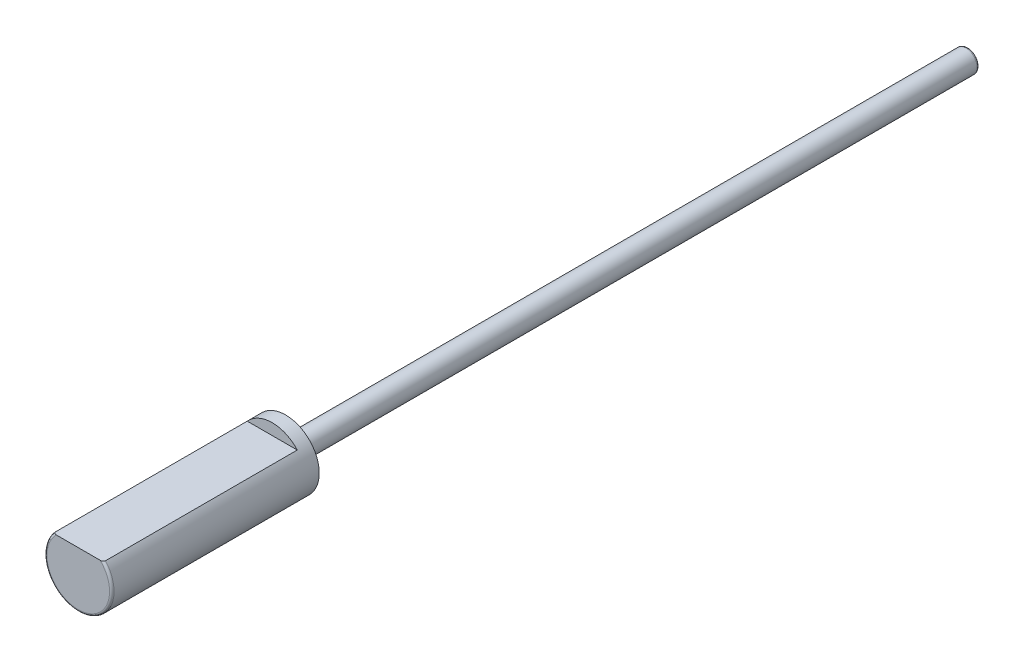
ISO-10303-21;
HEADER;
FILE_DESCRIPTION(('STEP AP214'),'2;1');
FILE_NAME('part.step','',(''),(''),'','','');
FILE_SCHEMA(('AUTOMOTIVE_DESIGN { 1 0 10303 214 1 1 1 1 }'));
ENDSEC;
DATA;
#1=APPLICATION_CONTEXT('core data for automotive mechanical design processes');
#2=APPLICATION_PROTOCOL_DEFINITION('international standard','automotive_design',2000,#1);
#3=PRODUCT_CONTEXT('',#1,'mechanical');
#4=PRODUCT('Part','Part','',(#3));
#5=PRODUCT_RELATED_PRODUCT_CATEGORY('part','',(#4));
#6=PRODUCT_DEFINITION_FORMATION('','',#4);
#7=PRODUCT_DEFINITION_CONTEXT('part definition',#1,'design');
#8=PRODUCT_DEFINITION('design','',#6,#7);
#9=PRODUCT_DEFINITION_SHAPE('','',#8);
#10=(LENGTH_UNIT() NAMED_UNIT(*) SI_UNIT(.MILLI.,.METRE.));
#11=(NAMED_UNIT(*) PLANE_ANGLE_UNIT() SI_UNIT($,.RADIAN.));
#12=(NAMED_UNIT(*) SI_UNIT($,.STERADIAN.) SOLID_ANGLE_UNIT());
#13=UNCERTAINTY_MEASURE_WITH_UNIT(LENGTH_MEASURE(1.E-05),#10,'distance_accuracy_value','');
#14=(GEOMETRIC_REPRESENTATION_CONTEXT(3) GLOBAL_UNCERTAINTY_ASSIGNED_CONTEXT((#13)) GLOBAL_UNIT_ASSIGNED_CONTEXT((#10,
#11,#12)) REPRESENTATION_CONTEXT('',''));
#15=CARTESIAN_POINT('',(0.,0.,0.));
#16=DIRECTION('',(0.,0.,1.));
#17=DIRECTION('',(1.,0.,0.));
#18=AXIS2_PLACEMENT_3D('',#15,#16,#17);
#19=CARTESIAN_POINT('',(0.,0.,-9.27));
#20=DIRECTION('',(0.,0.,1.));
#21=DIRECTION('',(1.,0.,0.));
#22=AXIS2_PLACEMENT_3D('',#19,#20,#21);
#23=PLANE('',#22);
#24=CARTESIAN_POINT('',(0.,0.,-9.27));
#25=DIRECTION('',(0.,0.,1.));
#26=DIRECTION('',(1.,0.,0.));
#27=AXIS2_PLACEMENT_3D('',#24,#25,#26);
#28=CIRCLE('',#27,1.5);
#29=CARTESIAN_POINT('',(1.5,0.,-9.27));
#30=VERTEX_POINT('',#29);
#31=EDGE_CURVE('E80',#30,#30,#28,.T.);
#32=ORIENTED_EDGE('',*,*,#31,.F.);
#33=EDGE_LOOP('',(#32));
#34=FACE_BOUND('',#33,.T.);
#35=CARTESIAN_POINT('',(0.,0.,-9.27));
#36=DIRECTION('',(0.,0.,1.));
#37=DIRECTION('',(1.,0.,0.));
#38=AXIS2_PLACEMENT_3D('',#35,#36,#37);
#39=CIRCLE('',#38,0.5);
#40=CARTESIAN_POINT('',(0.5,0.,-9.27));
#41=VERTEX_POINT('',#40);
#42=EDGE_CURVE('E86',#41,#41,#39,.F.);
#43=ORIENTED_EDGE('',*,*,#42,.F.);
#44=EDGE_LOOP('',(#43));
#45=FACE_BOUND('',#44,.T.);
#46=ADVANCED_FACE('F32',(#34,#45),#23,.F.);
#47=CARTESIAN_POINT('',(0.,0.,-9.27));
#48=DIRECTION('',(0.,0.,1.));
#49=DIRECTION('',(1.,0.,0.));
#50=AXIS2_PLACEMENT_3D('',#47,#48,#49);
#51=CYLINDRICAL_SURFACE('',#50,1.5);
#52=DIRECTION('',(0.,0.,1.));
#53=VECTOR('',#52,1.);
#54=CARTESIAN_POINT('',(1.11803398874989,1.,-8.67));
#55=LINE('',#54,#53);
#56=CARTESIAN_POINT('',(1.11803398874989,1.,-8.67));
#57=VERTEX_POINT('',#56);
#58=CARTESIAN_POINT('',(1.11803398874989,1.,-0.0999999999999994));
#59=VERTEX_POINT('',#58);
#60=EDGE_CURVE('E75',#57,#59,#55,.T.);
#61=ORIENTED_EDGE('',*,*,#60,.T.);
#62=CARTESIAN_POINT('',(0.,0.,-0.0999999999999994));
#63=DIRECTION('',(0.,0.,1.));
#64=DIRECTION('',(1.,0.,0.));
#65=AXIS2_PLACEMENT_3D('',#62,#63,#64);
#66=CIRCLE('',#65,1.5);
#67=CARTESIAN_POINT('',(-1.11803398874989,1.,-0.0999999999999994));
#68=VERTEX_POINT('',#67);
#69=EDGE_CURVE('E11',#59,#68,#66,.F.);
#70=ORIENTED_EDGE('',*,*,#69,.T.);
#71=DIRECTION('',(0.,0.,1.));
#72=VECTOR('',#71,1.);
#73=CARTESIAN_POINT('',(-1.11803398874989,1.,-8.67));
#74=LINE('',#73,#72);
#75=CARTESIAN_POINT('',(-1.11803398874989,1.,-8.67));
#76=VERTEX_POINT('',#75);
#77=EDGE_CURVE('E73',#76,#68,#74,.T.);
#78=ORIENTED_EDGE('',*,*,#77,.F.);
#79=CARTESIAN_POINT('',(0.,0.,-8.67));
#80=DIRECTION('',(0.,0.,1.));
#81=DIRECTION('',(1.,0.,0.));
#82=AXIS2_PLACEMENT_3D('',#79,#80,#81);
#83=CIRCLE('',#82,1.5);
#84=EDGE_CURVE('E66',#57,#76,#83,.T.);
#85=ORIENTED_EDGE('',*,*,#84,.F.);
#86=EDGE_LOOP('',(#61,#70,#78,#85));
#87=FACE_BOUND('',#86,.T.);
#88=ORIENTED_EDGE('',*,*,#31,.T.);
#89=EDGE_LOOP('',(#88));
#90=FACE_BOUND('',#89,.T.);
#91=ADVANCED_FACE('F77',(#87,#90),#51,.T.);
#92=CARTESIAN_POINT('',(0.,0.,0.));
#93=DIRECTION('',(0.,0.,1.));
#94=DIRECTION('',(1.,0.,0.));
#95=AXIS2_PLACEMENT_3D('',#92,#93,#94);
#96=PLANE('',#95);
#97=DIRECTION('',(1.,0.,0.));
#98=VECTOR('',#97,1.);
#99=CARTESIAN_POINT('',(-1.11803398874989,1.,0.));
#100=LINE('',#99,#98);
#101=CARTESIAN_POINT('',(-0.979795897113271,1.,0.));
#102=VERTEX_POINT('',#101);
#103=CARTESIAN_POINT('',(0.979795897113271,1.,0.));
#104=VERTEX_POINT('',#103);
#105=EDGE_CURVE('E70',#102,#104,#100,.T.);
#106=ORIENTED_EDGE('',*,*,#105,.F.);
#107=CARTESIAN_POINT('',(0.,0.,0.));
#108=DIRECTION('',(0.,0.,1.));
#109=DIRECTION('',(1.,0.,0.));
#110=AXIS2_PLACEMENT_3D('',#107,#108,#109);
#111=CIRCLE('',#110,1.4);
#112=EDGE_CURVE('E95',#102,#104,#111,.T.);
#113=ORIENTED_EDGE('',*,*,#112,.T.);
#114=EDGE_LOOP('',(#106,#113));
#115=FACE_BOUND('',#114,.T.);
#116=ADVANCED_FACE('F110',(#115),#96,.T.);
#117=CARTESIAN_POINT('',(-1.11803398874989,1.,-8.67));
#118=DIRECTION('',(0.,-1.,0.));
#119=DIRECTION('',(0.,0.,-1.));
#120=AXIS2_PLACEMENT_3D('',#117,#118,#119);
#121=PLANE('',#120);
#122=ORIENTED_EDGE('',*,*,#105,.T.);
#123=CARTESIAN_POINT('',(0.979795897113271,1.,0.));
#124=CARTESIAN_POINT('',(0.990423010555319,1.,-1.03855861505107E-05));
#125=CARTESIAN_POINT('',(1.00110275061369,1.,-0.000833049056409117));
#126=CARTESIAN_POINT('',(1.02227176438242,1.,-0.0042959301923684));
#127=CARTESIAN_POINT('',(1.03275786657518,1.,-0.00695511620443514));
#128=CARTESIAN_POINT('',(1.0497101668996,1.,-0.0130979345120357));
#129=CARTESIAN_POINT('',(1.05637422178191,1.,-0.0160318171149528));
#130=CARTESIAN_POINT('',(1.06915806055887,1.,-0.0228850002330611));
#131=CARTESIAN_POINT('',(1.07527973170944,1.,-0.0268006863132385));
#132=CARTESIAN_POINT('',(1.08545710181324,1.,-0.0346886934187335));
#133=CARTESIAN_POINT('',(1.08967032194297,1.,-0.0384570563161133));
#134=CARTESIAN_POINT('',(1.09743993481315,1.,-0.0466256760007156));
#135=CARTESIAN_POINT('',(1.10099680338497,1.,-0.0510254708758903));
#136=CARTESIAN_POINT('',(1.10668854421872,1.,-0.059565933134492));
#137=CARTESIAN_POINT('',(1.10896390497243,1.,-0.0636127363771502));
#138=CARTESIAN_POINT('',(1.1128098959919,1.,-0.0720255110213822));
#139=CARTESIAN_POINT('',(1.11438186093413,1.,-0.0763908595187036));
#140=CARTESIAN_POINT('',(1.11636876981202,1.,-0.0839772157908912));
#141=CARTESIAN_POINT('',(1.1169898255533,1.,-0.0871452376113928));
#142=CARTESIAN_POINT('',(1.11782393669661,1.,-0.0935411698182698));
#143=CARTESIAN_POINT('',(1.11803611977568,1.,-0.0967691934467747));
#144=CARTESIAN_POINT('',(1.1180339887584,1.,-0.0999999999977711));
#145=B_SPLINE_CURVE_WITH_KNOTS('',3,(#123,#124,#125,#126,#127,#128,#129,#130,#131,#132,#133,
#134,#135,#136,#137,#138,#139,#140,#141,#142,#143,#144),.UNSPECIFIED.,.F.,.F.,(4,2,2,2,2,2,2,2,
2,2,4),(0.,0.0319385529641672,0.0642120123531967,0.0859848686758867,0.107678717461913,
0.124575849978059,0.141460684135519,0.155332463387052,0.169177808484579,0.178837784330725,
0.188518346854204),.UNSPECIFIED.);
#146=EDGE_CURVE('E41',#104,#59,#145,.T.);
#147=ORIENTED_EDGE('',*,*,#146,.T.);
#148=ORIENTED_EDGE('',*,*,#60,.F.);
#149=DIRECTION('',(1.,0.,0.));
#150=VECTOR('',#149,1.);
#151=CARTESIAN_POINT('',(-1.11803398874989,1.,-8.67));
#152=LINE('',#151,#150);
#153=EDGE_CURVE('E69',#76,#57,#152,.T.);
#154=ORIENTED_EDGE('',*,*,#153,.F.);
#155=ORIENTED_EDGE('',*,*,#77,.T.);
#156=CARTESIAN_POINT('',(-1.11803398874989,1.,-0.0999999999999994));
#157=CARTESIAN_POINT('',(-1.11804355506767,1.,-0.0953936566735407));
#158=CARTESIAN_POINT('',(-1.11760767495534,1.,-0.0907965481149597));
#159=CARTESIAN_POINT('',(-1.11592640755541,1.,-0.081786066391901));
#160=CARTESIAN_POINT('',(-1.11468694782349,1.,-0.0773715976645056));
#161=CARTESIAN_POINT('',(-1.11148112452686,1.,-0.0688294406720696));
#162=CARTESIAN_POINT('',(-1.10951626319663,1.,-0.0647011805365982));
#163=CARTESIAN_POINT('',(-1.10496989240239,1.,-0.0567944752876496));
#164=CARTESIAN_POINT('',(-1.1023872371825,1.,-0.0530166984615249));
#165=CARTESIAN_POINT('',(-1.09574105356226,1.,-0.0446268725765702));
#166=CARTESIAN_POINT('',(-1.09147393420041,1.,-0.0401761172993146));
#167=CARTESIAN_POINT('',(-1.08227689951012,1.,-0.0320267312284288));
#168=CARTESIAN_POINT('',(-1.0773460197302,1.,-0.0283292149248945));
#169=CARTESIAN_POINT('',(-1.06523258514584,1.,-0.0205173867655279));
#170=CARTESIAN_POINT('',(-1.05785982705629,1.,-0.0166988699011358));
#171=CARTESIAN_POINT('',(-1.04259227403405,1.,-0.0102854853180762));
#172=CARTESIAN_POINT('',(-1.03469614491658,1.,-0.00769389368522714));
#173=CARTESIAN_POINT('',(-1.01898120481267,1.,-0.00373257687759999));
#174=CARTESIAN_POINT('',(-1.01117441814706,1.,-0.00231388331917927));
#175=CARTESIAN_POINT('',(-0.995506567378695,1.,-0.000453420722760612));
#176=CARTESIAN_POINT('',(-0.987646425384097,1.,-3.9898205160243E-06));
#177=CARTESIAN_POINT('',(-0.979795897114114,1.,3.34790897037023E-12));
#178=B_SPLINE_CURVE_WITH_KNOTS('',3,(#156,#157,#158,#159,#160,#161,#162,#163,#164,#165,#166,
#167,#168,#169,#170,#171,#172,#173,#174,#175,#176,#177),.UNSPECIFIED.,.F.,.F.,(4,2,2,2,2,2,2,2,
2,2,4),(0.,0.0137838169773244,0.0274670978266051,0.0411221994763035,0.054802824843836,
0.073199155540583,0.091622510799885,0.116397542132985,0.141238358752926,0.164980587613975,
0.188534439423893),.UNSPECIFIED.);
#179=EDGE_CURVE('E98',#68,#102,#178,.T.);
#180=ORIENTED_EDGE('',*,*,#179,.T.);
#181=EDGE_LOOP('',(#122,#147,#148,#154,#155,#180));
#182=FACE_BOUND('',#181,.T.);
#183=ADVANCED_FACE('F72',(#182),#121,.F.);
#184=CARTESIAN_POINT('',(0.,0.,-8.67));
#185=DIRECTION('',(0.,0.,1.));
#186=DIRECTION('',(1.,0.,0.));
#187=AXIS2_PLACEMENT_3D('',#184,#185,#186);
#188=PLANE('',#187);
#189=ORIENTED_EDGE('',*,*,#84,.T.);
#190=ORIENTED_EDGE('',*,*,#153,.T.);
#191=EDGE_LOOP('',(#189,#190));
#192=FACE_BOUND('',#191,.T.);
#193=ADVANCED_FACE('F68',(#192),#188,.T.);
#194=CARTESIAN_POINT('',(0.,0.,-39.77));
#195=DIRECTION('',(0.,0.,1.));
#196=DIRECTION('',(1.,0.,0.));
#197=AXIS2_PLACEMENT_3D('',#194,#195,#196);
#198=CYLINDRICAL_SURFACE('',#197,0.5);
#199=CARTESIAN_POINT('',(0.,0.,-39.67));
#200=DIRECTION('',(0.,0.,-1.));
#201=DIRECTION('',(-1.,0.,0.));
#202=AXIS2_PLACEMENT_3D('',#199,#200,#201);
#203=CIRCLE('',#202,0.5);
#204=CARTESIAN_POINT('',(-0.5,0.,-39.67));
#205=VERTEX_POINT('',#204);
#206=EDGE_CURVE('E92',#205,#205,#203,.F.);
#207=ORIENTED_EDGE('',*,*,#206,.T.);
#208=EDGE_LOOP('',(#207));
#209=FACE_BOUND('',#208,.T.);
#210=ORIENTED_EDGE('',*,*,#42,.T.);
#211=EDGE_LOOP('',(#210));
#212=FACE_BOUND('',#211,.T.);
#213=ADVANCED_FACE('F129',(#209,#212),#198,.T.);
#214=CARTESIAN_POINT('',(0.,0.,-39.77));
#215=DIRECTION('',(0.,0.,-1.));
#216=DIRECTION('',(-1.,0.,0.));
#217=AXIS2_PLACEMENT_3D('',#214,#215,#216);
#218=PLANE('',#217);
#219=CARTESIAN_POINT('',(0.,0.,-39.77));
#220=DIRECTION('',(0.,0.,-1.));
#221=DIRECTION('',(-1.,0.,0.));
#222=AXIS2_PLACEMENT_3D('',#219,#220,#221);
#223=CIRCLE('',#222,0.4);
#224=CARTESIAN_POINT('',(-0.4,0.,-39.77));
#225=VERTEX_POINT('',#224);
#226=EDGE_CURVE('E89',#225,#225,#223,.T.);
#227=ORIENTED_EDGE('',*,*,#226,.T.);
#228=EDGE_LOOP('',(#227));
#229=FACE_BOUND('',#228,.T.);
#230=ADVANCED_FACE('F122',(#229),#218,.T.);
#231=CARTESIAN_POINT('',(0.,0.,-39.67));
#232=DIRECTION('',(0.,0.,-1.));
#233=DIRECTION('',(-1.,0.,0.));
#234=AXIS2_PLACEMENT_3D('',#231,#232,#233);
#235=TOROIDAL_SURFACE('',#234,0.4,0.1);
#236=ORIENTED_EDGE('',*,*,#206,.F.);
#237=EDGE_LOOP('',(#236));
#238=FACE_BOUND('',#237,.T.);
#239=ORIENTED_EDGE('',*,*,#226,.F.);
#240=EDGE_LOOP('',(#239));
#241=FACE_BOUND('',#240,.T.);
#242=ADVANCED_FACE('F120',(#238,#241),#235,.T.);
#243=CARTESIAN_POINT('',(0.,0.,-0.0999999999999994));
#244=DIRECTION('',(0.,0.,1.));
#245=DIRECTION('',(1.,0.,0.));
#246=AXIS2_PLACEMENT_3D('',#243,#244,#245);
#247=TOROIDAL_SURFACE('',#246,1.4,0.1);
#248=ORIENTED_EDGE('',*,*,#179,.F.);
#249=ORIENTED_EDGE('',*,*,#69,.F.);
#250=ORIENTED_EDGE('',*,*,#146,.F.);
#251=ORIENTED_EDGE('',*,*,#112,.F.);
#252=EDGE_LOOP('',(#248,#249,#250,#251));
#253=FACE_BOUND('',#252,.T.);
#254=ADVANCED_FACE('F34',(#253),#247,.T.);
#255=CLOSED_SHELL('',(#46,#91,#116,#183,#193,#213,#230,#242,#254));
#256=MANIFOLD_SOLID_BREP('B2',#255);
#257=ADVANCED_BREP_SHAPE_REPRESENTATION('',(#18,#256),#14);
#258=SHAPE_DEFINITION_REPRESENTATION(#9,#257);
ENDSEC;
END-ISO-10303-21;
